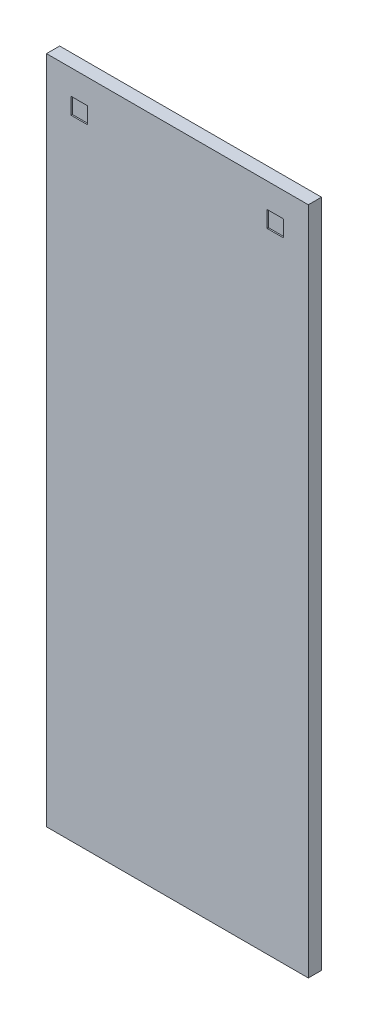
ISO-10303-21;
HEADER;
FILE_DESCRIPTION(('STEP AP214'),'2;1');
FILE_NAME('part.step','',(''),(''),'','','');
FILE_SCHEMA(('AUTOMOTIVE_DESIGN { 1 0 10303 214 1 1 1 1 }'));
ENDSEC;
DATA;
#1=APPLICATION_CONTEXT('core data for automotive mechanical design processes');
#2=APPLICATION_PROTOCOL_DEFINITION('international standard','automotive_design',2000,#1);
#3=PRODUCT_CONTEXT('',#1,'mechanical');
#4=PRODUCT('Part','Part','',(#3));
#5=PRODUCT_RELATED_PRODUCT_CATEGORY('part','',(#4));
#6=PRODUCT_DEFINITION_FORMATION('','',#4);
#7=PRODUCT_DEFINITION_CONTEXT('part definition',#1,'design');
#8=PRODUCT_DEFINITION('design','',#6,#7);
#9=PRODUCT_DEFINITION_SHAPE('','',#8);
#10=(LENGTH_UNIT() NAMED_UNIT(*) SI_UNIT(.MILLI.,.METRE.));
#11=(NAMED_UNIT(*) PLANE_ANGLE_UNIT() SI_UNIT($,.RADIAN.));
#12=(NAMED_UNIT(*) SI_UNIT($,.STERADIAN.) SOLID_ANGLE_UNIT());
#13=UNCERTAINTY_MEASURE_WITH_UNIT(LENGTH_MEASURE(1.E-05),#10,'distance_accuracy_value','');
#14=(GEOMETRIC_REPRESENTATION_CONTEXT(3) GLOBAL_UNCERTAINTY_ASSIGNED_CONTEXT((#13)) GLOBAL_UNIT_ASSIGNED_CONTEXT((#10,
#11,#12)) REPRESENTATION_CONTEXT('',''));
#15=CARTESIAN_POINT('',(0.,0.,0.));
#16=DIRECTION('',(0.,0.,1.));
#17=DIRECTION('',(1.,0.,0.));
#18=AXIS2_PLACEMENT_3D('',#15,#16,#17);
#19=CARTESIAN_POINT('',(199.,-509.,20.));
#20=DIRECTION('',(0.,-1.,0.));
#21=DIRECTION('',(0.,0.,-1.));
#22=AXIS2_PLACEMENT_3D('',#19,#20,#21);
#23=PLANE('',#22);
#24=DIRECTION('',(-1.,0.,0.));
#25=VECTOR('',#24,1.);
#26=CARTESIAN_POINT('',(199.,-509.,0.));
#27=LINE('',#26,#25);
#28=CARTESIAN_POINT('',(199.,-509.,0.));
#29=VERTEX_POINT('',#28);
#30=CARTESIAN_POINT('',(-199.,-509.,0.));
#31=VERTEX_POINT('',#30);
#32=EDGE_CURVE('E158',#29,#31,#27,.T.);
#33=ORIENTED_EDGE('',*,*,#32,.F.);
#34=DIRECTION('',(0.,0.,-1.));
#35=VECTOR('',#34,1.);
#36=CARTESIAN_POINT('',(199.,-509.,20.));
#37=LINE('',#36,#35);
#38=CARTESIAN_POINT('',(199.,-509.,20.));
#39=VERTEX_POINT('',#38);
#40=EDGE_CURVE('E11',#39,#29,#37,.T.);
#41=ORIENTED_EDGE('',*,*,#40,.F.);
#42=DIRECTION('',(-1.,0.,0.));
#43=VECTOR('',#42,1.);
#44=CARTESIAN_POINT('',(199.,-509.,20.));
#45=LINE('',#44,#43);
#46=CARTESIAN_POINT('',(-199.,-509.,20.));
#47=VERTEX_POINT('',#46);
#48=EDGE_CURVE('E191',#39,#47,#45,.T.);
#49=ORIENTED_EDGE('',*,*,#48,.T.);
#50=DIRECTION('',(0.,0.,-1.));
#51=VECTOR('',#50,1.);
#52=CARTESIAN_POINT('',(-199.,-509.,20.));
#53=LINE('',#52,#51);
#54=EDGE_CURVE('E36',#47,#31,#53,.T.);
#55=ORIENTED_EDGE('',*,*,#54,.T.);
#56=EDGE_LOOP('',(#33,#41,#49,#55));
#57=FACE_BOUND('',#56,.T.);
#58=ADVANCED_FACE('F33',(#57),#23,.T.);
#59=CARTESIAN_POINT('',(199.,-509.,20.));
#60=DIRECTION('',(-1.,0.,0.));
#61=DIRECTION('',(0.,0.,1.));
#62=AXIS2_PLACEMENT_3D('',#59,#60,#61);
#63=PLANE('',#62);
#64=DIRECTION('',(0.,1.,0.));
#65=VECTOR('',#64,1.);
#66=CARTESIAN_POINT('',(199.,-509.,0.));
#67=LINE('',#66,#65);
#68=CARTESIAN_POINT('',(199.,509.,0.));
#69=VERTEX_POINT('',#68);
#70=EDGE_CURVE('E195',#29,#69,#67,.T.);
#71=ORIENTED_EDGE('',*,*,#70,.T.);
#72=DIRECTION('',(0.,0.,-1.));
#73=VECTOR('',#72,1.);
#74=CARTESIAN_POINT('',(199.,509.,20.));
#75=LINE('',#74,#73);
#76=CARTESIAN_POINT('',(199.,509.,20.));
#77=VERTEX_POINT('',#76);
#78=EDGE_CURVE('E41',#77,#69,#75,.T.);
#79=ORIENTED_EDGE('',*,*,#78,.F.);
#80=DIRECTION('',(0.,1.,0.));
#81=VECTOR('',#80,1.);
#82=CARTESIAN_POINT('',(199.,-509.,20.));
#83=LINE('',#82,#81);
#84=EDGE_CURVE('E200',#39,#77,#83,.T.);
#85=ORIENTED_EDGE('',*,*,#84,.F.);
#86=ORIENTED_EDGE('',*,*,#40,.T.);
#87=EDGE_LOOP('',(#71,#79,#85,#86));
#88=FACE_BOUND('',#87,.T.);
#89=ADVANCED_FACE('F227',(#88),#63,.F.);
#90=CARTESIAN_POINT('',(199.,509.,20.));
#91=DIRECTION('',(0.,-1.,0.));
#92=DIRECTION('',(1.,0.,0.));
#93=AXIS2_PLACEMENT_3D('',#90,#91,#92);
#94=PLANE('',#93);
#95=DIRECTION('',(-1.,0.,0.));
#96=VECTOR('',#95,1.);
#97=CARTESIAN_POINT('',(199.,509.,0.));
#98=LINE('',#97,#96);
#99=CARTESIAN_POINT('',(-199.,509.,0.));
#100=VERTEX_POINT('',#99);
#101=EDGE_CURVE('E207',#69,#100,#98,.T.);
#102=ORIENTED_EDGE('',*,*,#101,.T.);
#103=DIRECTION('',(0.,0.,-1.));
#104=VECTOR('',#103,1.);
#105=CARTESIAN_POINT('',(-199.,509.,20.));
#106=LINE('',#105,#104);
#107=CARTESIAN_POINT('',(-199.,509.,20.));
#108=VERTEX_POINT('',#107);
#109=EDGE_CURVE('E212',#108,#100,#106,.T.);
#110=ORIENTED_EDGE('',*,*,#109,.F.);
#111=DIRECTION('',(-1.,0.,0.));
#112=VECTOR('',#111,1.);
#113=CARTESIAN_POINT('',(199.,509.,20.));
#114=LINE('',#113,#112);
#115=EDGE_CURVE('E198',#77,#108,#114,.T.);
#116=ORIENTED_EDGE('',*,*,#115,.F.);
#117=ORIENTED_EDGE('',*,*,#78,.T.);
#118=EDGE_LOOP('',(#102,#110,#116,#117));
#119=FACE_BOUND('',#118,.T.);
#120=ADVANCED_FACE('F231',(#119),#94,.F.);
#121=CARTESIAN_POINT('',(-199.,-509.,20.));
#122=DIRECTION('',(-1.,0.,0.));
#123=DIRECTION('',(0.,0.,1.));
#124=AXIS2_PLACEMENT_3D('',#121,#122,#123);
#125=PLANE('',#124);
#126=DIRECTION('',(0.,1.,0.));
#127=VECTOR('',#126,1.);
#128=CARTESIAN_POINT('',(-199.,-509.,0.));
#129=LINE('',#128,#127);
#130=EDGE_CURVE('E204',#31,#100,#129,.T.);
#131=ORIENTED_EDGE('',*,*,#130,.F.);
#132=ORIENTED_EDGE('',*,*,#54,.F.);
#133=DIRECTION('',(0.,1.,0.));
#134=VECTOR('',#133,1.);
#135=CARTESIAN_POINT('',(-199.,-509.,20.));
#136=LINE('',#135,#134);
#137=EDGE_CURVE('E194',#47,#108,#136,.T.);
#138=ORIENTED_EDGE('',*,*,#137,.T.);
#139=ORIENTED_EDGE('',*,*,#109,.T.);
#140=EDGE_LOOP('',(#131,#132,#138,#139));
#141=FACE_BOUND('',#140,.T.);
#142=ADVANCED_FACE('F220',(#141),#125,.T.);
#143=CARTESIAN_POINT('',(0.,0.,20.));
#144=DIRECTION('',(0.,0.,-1.));
#145=DIRECTION('',(-1.,0.,0.));
#146=AXIS2_PLACEMENT_3D('',#143,#144,#145);
#147=PLANE('',#146);
#148=DIRECTION('',(1.,0.,0.));
#149=VECTOR('',#148,1.);
#150=CARTESIAN_POINT('',(161.5,446.5,20.));
#151=LINE('',#150,#149);
#152=CARTESIAN_POINT('',(136.5,446.5,20.));
#153=VERTEX_POINT('',#152);
#154=CARTESIAN_POINT('',(161.5,446.5,20.));
#155=VERTEX_POINT('',#154);
#156=EDGE_CURVE('E151',#153,#155,#151,.T.);
#157=ORIENTED_EDGE('',*,*,#156,.F.);
#158=DIRECTION('',(0.,-1.,0.));
#159=VECTOR('',#158,1.);
#160=CARTESIAN_POINT('',(136.5,446.5,20.));
#161=LINE('',#160,#159);
#162=CARTESIAN_POINT('',(136.5,471.5,20.));
#163=VERTEX_POINT('',#162);
#164=EDGE_CURVE('E49',#163,#153,#161,.T.);
#165=ORIENTED_EDGE('',*,*,#164,.F.);
#166=DIRECTION('',(-1.,0.,0.));
#167=VECTOR('',#166,1.);
#168=CARTESIAN_POINT('',(161.5,471.5,20.));
#169=LINE('',#168,#167);
#170=CARTESIAN_POINT('',(161.5,471.5,20.));
#171=VERTEX_POINT('',#170);
#172=EDGE_CURVE('E142',#171,#163,#169,.T.);
#173=ORIENTED_EDGE('',*,*,#172,.F.);
#174=DIRECTION('',(0.,1.,0.));
#175=VECTOR('',#174,1.);
#176=CARTESIAN_POINT('',(161.5,446.5,20.));
#177=LINE('',#176,#175);
#178=EDGE_CURVE('E145',#155,#171,#177,.T.);
#179=ORIENTED_EDGE('',*,*,#178,.F.);
#180=EDGE_LOOP('',(#157,#165,#173,#179));
#181=FACE_BOUND('',#180,.T.);
#182=DIRECTION('',(1.,0.,0.));
#183=VECTOR('',#182,1.);
#184=CARTESIAN_POINT('',(-136.5,446.5,20.));
#185=LINE('',#184,#183);
#186=CARTESIAN_POINT('',(-161.5,446.5,20.));
#187=VERTEX_POINT('',#186);
#188=CARTESIAN_POINT('',(-136.5,446.5,20.));
#189=VERTEX_POINT('',#188);
#190=EDGE_CURVE('E177',#187,#189,#185,.T.);
#191=ORIENTED_EDGE('',*,*,#190,.F.);
#192=DIRECTION('',(0.,-1.,0.));
#193=VECTOR('',#192,1.);
#194=CARTESIAN_POINT('',(-161.5,446.5,20.));
#195=LINE('',#194,#193);
#196=CARTESIAN_POINT('',(-161.5,471.5,20.));
#197=VERTEX_POINT('',#196);
#198=EDGE_CURVE('E57',#197,#187,#195,.T.);
#199=ORIENTED_EDGE('',*,*,#198,.F.);
#200=DIRECTION('',(-1.,0.,0.));
#201=VECTOR('',#200,1.);
#202=CARTESIAN_POINT('',(-136.5,471.5,20.));
#203=LINE('',#202,#201);
#204=CARTESIAN_POINT('',(-136.5,471.5,20.));
#205=VERTEX_POINT('',#204);
#206=EDGE_CURVE('E166',#205,#197,#203,.T.);
#207=ORIENTED_EDGE('',*,*,#206,.F.);
#208=DIRECTION('',(0.,1.,0.));
#209=VECTOR('',#208,1.);
#210=CARTESIAN_POINT('',(-136.5,446.5,20.));
#211=LINE('',#210,#209);
#212=EDGE_CURVE('E180',#189,#205,#211,.T.);
#213=ORIENTED_EDGE('',*,*,#212,.F.);
#214=EDGE_LOOP('',(#191,#199,#207,#213));
#215=FACE_BOUND('',#214,.T.);
#216=ORIENTED_EDGE('',*,*,#48,.F.);
#217=ORIENTED_EDGE('',*,*,#84,.T.);
#218=ORIENTED_EDGE('',*,*,#115,.T.);
#219=ORIENTED_EDGE('',*,*,#137,.F.);
#220=EDGE_LOOP('',(#216,#217,#218,#219));
#221=FACE_BOUND('',#220,.T.);
#222=ADVANCED_FACE('F233',(#181,#215,#221),#147,.F.);
#223=CARTESIAN_POINT('',(0.,0.,0.));
#224=DIRECTION('',(0.,0.,-1.));
#225=DIRECTION('',(-1.,0.,0.));
#226=AXIS2_PLACEMENT_3D('',#223,#224,#225);
#227=PLANE('',#226);
#228=ORIENTED_EDGE('',*,*,#32,.T.);
#229=ORIENTED_EDGE('',*,*,#130,.T.);
#230=ORIENTED_EDGE('',*,*,#101,.F.);
#231=ORIENTED_EDGE('',*,*,#70,.F.);
#232=EDGE_LOOP('',(#228,#229,#230,#231));
#233=FACE_BOUND('',#232,.T.);
#234=ADVANCED_FACE('F224',(#233),#227,.T.);
#235=CARTESIAN_POINT('',(-161.5,446.5,18.));
#236=DIRECTION('',(-1.,0.,0.));
#237=DIRECTION('',(0.,0.,1.));
#238=AXIS2_PLACEMENT_3D('',#235,#236,#237);
#239=PLANE('',#238);
#240=ORIENTED_EDGE('',*,*,#198,.T.);
#241=DIRECTION('',(0.,0.,1.));
#242=VECTOR('',#241,1.);
#243=CARTESIAN_POINT('',(-161.5,446.5,18.));
#244=LINE('',#243,#242);
#245=CARTESIAN_POINT('',(-161.5,446.5,18.));
#246=VERTEX_POINT('',#245);
#247=EDGE_CURVE('E175',#246,#187,#244,.T.);
#248=ORIENTED_EDGE('',*,*,#247,.F.);
#249=DIRECTION('',(0.,-1.,0.));
#250=VECTOR('',#249,1.);
#251=CARTESIAN_POINT('',(-161.5,446.5,18.));
#252=LINE('',#251,#250);
#253=CARTESIAN_POINT('',(-161.5,471.5,18.));
#254=VERTEX_POINT('',#253);
#255=EDGE_CURVE('E162',#254,#246,#252,.T.);
#256=ORIENTED_EDGE('',*,*,#255,.F.);
#257=DIRECTION('',(0.,0.,1.));
#258=VECTOR('',#257,1.);
#259=CARTESIAN_POINT('',(-161.5,471.5,18.));
#260=LINE('',#259,#258);
#261=EDGE_CURVE('E152',#254,#197,#260,.T.);
#262=ORIENTED_EDGE('',*,*,#261,.T.);
#263=EDGE_LOOP('',(#240,#248,#256,#262));
#264=FACE_BOUND('',#263,.T.);
#265=ADVANCED_FACE('F241',(#264),#239,.F.);
#266=CARTESIAN_POINT('',(-136.5,471.5,18.));
#267=DIRECTION('',(0.,1.,0.));
#268=DIRECTION('',(0.,0.,1.));
#269=AXIS2_PLACEMENT_3D('',#266,#267,#268);
#270=PLANE('',#269);
#271=ORIENTED_EDGE('',*,*,#206,.T.);
#272=ORIENTED_EDGE('',*,*,#261,.F.);
#273=DIRECTION('',(-1.,0.,0.));
#274=VECTOR('',#273,1.);
#275=CARTESIAN_POINT('',(-136.5,471.5,18.));
#276=LINE('',#275,#274);
#277=CARTESIAN_POINT('',(-136.5,471.5,18.));
#278=VERTEX_POINT('',#277);
#279=EDGE_CURVE('E172',#278,#254,#276,.T.);
#280=ORIENTED_EDGE('',*,*,#279,.F.);
#281=DIRECTION('',(0.,0.,1.));
#282=VECTOR('',#281,1.);
#283=CARTESIAN_POINT('',(-136.5,471.5,18.));
#284=LINE('',#283,#282);
#285=EDGE_CURVE('E186',#278,#205,#284,.T.);
#286=ORIENTED_EDGE('',*,*,#285,.T.);
#287=EDGE_LOOP('',(#271,#272,#280,#286));
#288=FACE_BOUND('',#287,.T.);
#289=ADVANCED_FACE('F279',(#288),#270,.F.);
#290=CARTESIAN_POINT('',(-136.5,446.5,18.));
#291=DIRECTION('',(1.,0.,0.));
#292=DIRECTION('',(0.,0.,-1.));
#293=AXIS2_PLACEMENT_3D('',#290,#291,#292);
#294=PLANE('',#293);
#295=ORIENTED_EDGE('',*,*,#212,.T.);
#296=ORIENTED_EDGE('',*,*,#285,.F.);
#297=DIRECTION('',(0.,1.,0.));
#298=VECTOR('',#297,1.);
#299=CARTESIAN_POINT('',(-136.5,446.5,18.));
#300=LINE('',#299,#298);
#301=CARTESIAN_POINT('',(-136.5,446.5,18.));
#302=VERTEX_POINT('',#301);
#303=EDGE_CURVE('E169',#302,#278,#300,.T.);
#304=ORIENTED_EDGE('',*,*,#303,.F.);
#305=DIRECTION('',(0.,0.,1.));
#306=VECTOR('',#305,1.);
#307=CARTESIAN_POINT('',(-136.5,446.5,18.));
#308=LINE('',#307,#306);
#309=EDGE_CURVE('E188',#302,#189,#308,.T.);
#310=ORIENTED_EDGE('',*,*,#309,.T.);
#311=EDGE_LOOP('',(#295,#296,#304,#310));
#312=FACE_BOUND('',#311,.T.);
#313=ADVANCED_FACE('F287',(#312),#294,.F.);
#314=CARTESIAN_POINT('',(-136.5,446.5,18.));
#315=DIRECTION('',(0.,-1.,0.));
#316=DIRECTION('',(0.,0.,-1.));
#317=AXIS2_PLACEMENT_3D('',#314,#315,#316);
#318=PLANE('',#317);
#319=ORIENTED_EDGE('',*,*,#190,.T.);
#320=ORIENTED_EDGE('',*,*,#309,.F.);
#321=DIRECTION('',(1.,0.,0.));
#322=VECTOR('',#321,1.);
#323=CARTESIAN_POINT('',(-136.5,446.5,18.));
#324=LINE('',#323,#322);
#325=EDGE_CURVE('E165',#246,#302,#324,.T.);
#326=ORIENTED_EDGE('',*,*,#325,.F.);
#327=ORIENTED_EDGE('',*,*,#247,.T.);
#328=EDGE_LOOP('',(#319,#320,#326,#327));
#329=FACE_BOUND('',#328,.T.);
#330=ADVANCED_FACE('F297',(#329),#318,.F.);
#331=CARTESIAN_POINT('',(0.,0.,18.));
#332=DIRECTION('',(0.,0.,1.));
#333=DIRECTION('',(1.,0.,0.));
#334=AXIS2_PLACEMENT_3D('',#331,#332,#333);
#335=PLANE('',#334);
#336=ORIENTED_EDGE('',*,*,#255,.T.);
#337=ORIENTED_EDGE('',*,*,#325,.T.);
#338=ORIENTED_EDGE('',*,*,#303,.T.);
#339=ORIENTED_EDGE('',*,*,#279,.T.);
#340=EDGE_LOOP('',(#336,#337,#338,#339));
#341=FACE_BOUND('',#340,.T.);
#342=ADVANCED_FACE('F307',(#341),#335,.T.);
#343=CARTESIAN_POINT('',(136.5,446.5,18.));
#344=DIRECTION('',(-1.,0.,0.));
#345=DIRECTION('',(0.,0.,1.));
#346=AXIS2_PLACEMENT_3D('',#343,#344,#345);
#347=PLANE('',#346);
#348=ORIENTED_EDGE('',*,*,#164,.T.);
#349=DIRECTION('',(0.,0.,1.));
#350=VECTOR('',#349,1.);
#351=CARTESIAN_POINT('',(136.5,446.5,18.));
#352=LINE('',#351,#350);
#353=CARTESIAN_POINT('',(136.5,446.5,18.));
#354=VERTEX_POINT('',#353);
#355=EDGE_CURVE('E120',#354,#153,#352,.T.);
#356=ORIENTED_EDGE('',*,*,#355,.F.);
#357=DIRECTION('',(0.,-1.,0.));
#358=VECTOR('',#357,1.);
#359=CARTESIAN_POINT('',(136.5,446.5,18.));
#360=LINE('',#359,#358);
#361=CARTESIAN_POINT('',(136.5,471.5,18.));
#362=VERTEX_POINT('',#361);
#363=EDGE_CURVE('E124',#362,#354,#360,.T.);
#364=ORIENTED_EDGE('',*,*,#363,.F.);
#365=DIRECTION('',(0.,0.,1.));
#366=VECTOR('',#365,1.);
#367=CARTESIAN_POINT('',(136.5,471.5,18.));
#368=LINE('',#367,#366);
#369=EDGE_CURVE('E156',#362,#163,#368,.T.);
#370=ORIENTED_EDGE('',*,*,#369,.T.);
#371=EDGE_LOOP('',(#348,#356,#364,#370));
#372=FACE_BOUND('',#371,.T.);
#373=ADVANCED_FACE('F122',(#372),#347,.F.);
#374=CARTESIAN_POINT('',(161.5,471.5,18.));
#375=DIRECTION('',(0.,1.,0.));
#376=DIRECTION('',(0.,0.,1.));
#377=AXIS2_PLACEMENT_3D('',#374,#375,#376);
#378=PLANE('',#377);
#379=ORIENTED_EDGE('',*,*,#172,.T.);
#380=ORIENTED_EDGE('',*,*,#369,.F.);
#381=DIRECTION('',(-1.,0.,0.));
#382=VECTOR('',#381,1.);
#383=CARTESIAN_POINT('',(161.5,471.5,18.));
#384=LINE('',#383,#382);
#385=CARTESIAN_POINT('',(161.5,471.5,18.));
#386=VERTEX_POINT('',#385);
#387=EDGE_CURVE('E130',#386,#362,#384,.T.);
#388=ORIENTED_EDGE('',*,*,#387,.F.);
#389=DIRECTION('',(0.,0.,1.));
#390=VECTOR('',#389,1.);
#391=CARTESIAN_POINT('',(161.5,471.5,18.));
#392=LINE('',#391,#390);
#393=EDGE_CURVE('E159',#386,#171,#392,.T.);
#394=ORIENTED_EDGE('',*,*,#393,.T.);
#395=EDGE_LOOP('',(#379,#380,#388,#394));
#396=FACE_BOUND('',#395,.T.);
#397=ADVANCED_FACE('F326',(#396),#378,.F.);
#398=CARTESIAN_POINT('',(161.5,446.5,18.));
#399=DIRECTION('',(1.,0.,0.));
#400=DIRECTION('',(0.,0.,-1.));
#401=AXIS2_PLACEMENT_3D('',#398,#399,#400);
#402=PLANE('',#401);
#403=ORIENTED_EDGE('',*,*,#178,.T.);
#404=ORIENTED_EDGE('',*,*,#393,.F.);
#405=DIRECTION('',(0.,1.,0.));
#406=VECTOR('',#405,1.);
#407=CARTESIAN_POINT('',(161.5,446.5,18.));
#408=LINE('',#407,#406);
#409=CARTESIAN_POINT('',(161.5,446.5,18.));
#410=VERTEX_POINT('',#409);
#411=EDGE_CURVE('E138',#410,#386,#408,.T.);
#412=ORIENTED_EDGE('',*,*,#411,.F.);
#413=DIRECTION('',(0.,0.,1.));
#414=VECTOR('',#413,1.);
#415=CARTESIAN_POINT('',(161.5,446.5,18.));
#416=LINE('',#415,#414);
#417=EDGE_CURVE('E129',#410,#155,#416,.T.);
#418=ORIENTED_EDGE('',*,*,#417,.T.);
#419=EDGE_LOOP('',(#403,#404,#412,#418));
#420=FACE_BOUND('',#419,.T.);
#421=ADVANCED_FACE('F335',(#420),#402,.F.);
#422=CARTESIAN_POINT('',(161.5,446.5,18.));
#423=DIRECTION('',(0.,-1.,0.));
#424=DIRECTION('',(0.,0.,-1.));
#425=AXIS2_PLACEMENT_3D('',#422,#423,#424);
#426=PLANE('',#425);
#427=ORIENTED_EDGE('',*,*,#156,.T.);
#428=ORIENTED_EDGE('',*,*,#417,.F.);
#429=DIRECTION('',(1.,0.,0.));
#430=VECTOR('',#429,1.);
#431=CARTESIAN_POINT('',(161.5,446.5,18.));
#432=LINE('',#431,#430);
#433=EDGE_CURVE('E133',#354,#410,#432,.T.);
#434=ORIENTED_EDGE('',*,*,#433,.F.);
#435=ORIENTED_EDGE('',*,*,#355,.T.);
#436=EDGE_LOOP('',(#427,#428,#434,#435));
#437=FACE_BOUND('',#436,.T.);
#438=ADVANCED_FACE('F134',(#437),#426,.F.);
#439=CARTESIAN_POINT('',(0.,0.,18.));
#440=DIRECTION('',(0.,0.,1.));
#441=DIRECTION('',(1.,0.,0.));
#442=AXIS2_PLACEMENT_3D('',#439,#440,#441);
#443=PLANE('',#442);
#444=ORIENTED_EDGE('',*,*,#363,.T.);
#445=ORIENTED_EDGE('',*,*,#433,.T.);
#446=ORIENTED_EDGE('',*,*,#411,.T.);
#447=ORIENTED_EDGE('',*,*,#387,.T.);
#448=EDGE_LOOP('',(#444,#445,#446,#447));
#449=FACE_BOUND('',#448,.T.);
#450=ADVANCED_FACE('F140',(#449),#443,.T.);
#451=CLOSED_SHELL('',(#58,#89,#120,#142,#222,#234,#265,#289,#313,#330,#342,#373,#397,#421,#438,#450));
#452=MANIFOLD_SOLID_BREP('B2',#451);
#453=ADVANCED_BREP_SHAPE_REPRESENTATION('',(#18,#452),#14);
#454=SHAPE_DEFINITION_REPRESENTATION(#9,#453);
ENDSEC;
END-ISO-10303-21;
